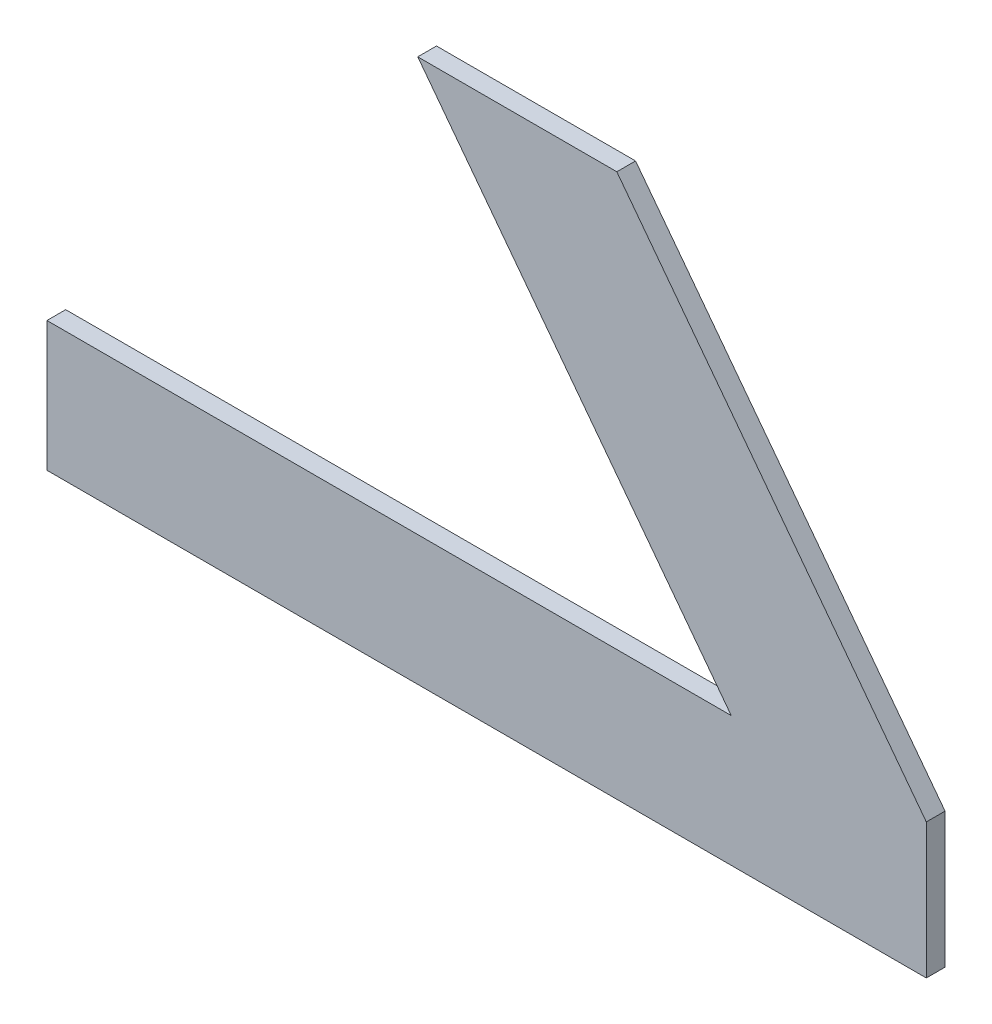
ISO-10303-21;
HEADER;
FILE_DESCRIPTION(('STEP AP214'),'2;1');
FILE_NAME('part.step','',(''),(''),'','','');
FILE_SCHEMA(('AUTOMOTIVE_DESIGN { 1 0 10303 214 1 1 1 1 }'));
ENDSEC;
DATA;
#1=APPLICATION_CONTEXT('core data for automotive mechanical design processes');
#2=APPLICATION_PROTOCOL_DEFINITION('international standard','automotive_design',2000,#1);
#3=PRODUCT_CONTEXT('',#1,'mechanical');
#4=PRODUCT('Part','Part','',(#3));
#5=PRODUCT_RELATED_PRODUCT_CATEGORY('part','',(#4));
#6=PRODUCT_DEFINITION_FORMATION('','',#4);
#7=PRODUCT_DEFINITION_CONTEXT('part definition',#1,'design');
#8=PRODUCT_DEFINITION('design','',#6,#7);
#9=PRODUCT_DEFINITION_SHAPE('','',#8);
#10=(LENGTH_UNIT() NAMED_UNIT(*) SI_UNIT(.MILLI.,.METRE.));
#11=(NAMED_UNIT(*) PLANE_ANGLE_UNIT() SI_UNIT($,.RADIAN.));
#12=(NAMED_UNIT(*) SI_UNIT($,.STERADIAN.) SOLID_ANGLE_UNIT());
#13=UNCERTAINTY_MEASURE_WITH_UNIT(LENGTH_MEASURE(1.E-05),#10,'distance_accuracy_value','');
#14=(GEOMETRIC_REPRESENTATION_CONTEXT(3) GLOBAL_UNCERTAINTY_ASSIGNED_CONTEXT((#13)) GLOBAL_UNIT_ASSIGNED_CONTEXT((#10,
#11,#12)) REPRESENTATION_CONTEXT('',''));
#15=CARTESIAN_POINT('',(0.,0.,0.));
#16=DIRECTION('',(0.,0.,1.));
#17=DIRECTION('',(1.,0.,0.));
#18=AXIS2_PLACEMENT_3D('',#15,#16,#17);
#19=CARTESIAN_POINT('',(11.9230769230769,-15.,0.5));
#20=DIRECTION('',(-1.,0.,0.));
#21=DIRECTION('',(0.,0.,1.));
#22=AXIS2_PLACEMENT_3D('',#19,#20,#21);
#23=PLANE('',#22);
#24=DIRECTION('',(0.,1.,0.));
#25=VECTOR('',#24,1.);
#26=CARTESIAN_POINT('',(11.9230769230769,-15.,0.));
#27=LINE('',#26,#25);
#28=CARTESIAN_POINT('',(11.9230769230769,-15.,0.));
#29=VERTEX_POINT('',#28);
#30=CARTESIAN_POINT('',(11.9230769230769,-11.3942307692308,0.));
#31=VERTEX_POINT('',#30);
#32=EDGE_CURVE('E129',#29,#31,#27,.T.);
#33=ORIENTED_EDGE('',*,*,#32,.T.);
#34=DIRECTION('',(0.,0.,-1.));
#35=VECTOR('',#34,1.);
#36=CARTESIAN_POINT('',(11.9230769230769,-11.3942307692308,0.5));
#37=LINE('',#36,#35);
#38=CARTESIAN_POINT('',(11.9230769230769,-11.3942307692308,0.5));
#39=VERTEX_POINT('',#38);
#40=EDGE_CURVE('E152',#39,#31,#37,.T.);
#41=ORIENTED_EDGE('',*,*,#40,.F.);
#42=DIRECTION('',(0.,1.,0.));
#43=VECTOR('',#42,1.);
#44=CARTESIAN_POINT('',(11.9230769230769,-15.,0.5));
#45=LINE('',#44,#43);
#46=CARTESIAN_POINT('',(11.9230769230769,-15.,0.5));
#47=VERTEX_POINT('',#46);
#48=EDGE_CURVE('E153',#47,#39,#45,.T.);
#49=ORIENTED_EDGE('',*,*,#48,.F.);
#50=DIRECTION('',(0.,0.,-1.));
#51=VECTOR('',#50,1.);
#52=CARTESIAN_POINT('',(11.9230769230769,-15.,0.5));
#53=LINE('',#52,#51);
#54=EDGE_CURVE('E48',#47,#29,#53,.T.);
#55=ORIENTED_EDGE('',*,*,#54,.T.);
#56=EDGE_LOOP('',(#33,#41,#49,#55));
#57=FACE_BOUND('',#56,.T.);
#58=ADVANCED_FACE('F39',(#57),#23,.F.);
#59=CARTESIAN_POINT('',(-11.5384615384615,-15.,0.5));
#60=DIRECTION('',(0.,1.,0.));
#61=DIRECTION('',(0.,0.,1.));
#62=AXIS2_PLACEMENT_3D('',#59,#60,#61);
#63=PLANE('',#62);
#64=DIRECTION('',(1.,0.,0.));
#65=VECTOR('',#64,1.);
#66=CARTESIAN_POINT('',(-11.5384615384615,-15.,0.));
#67=LINE('',#66,#65);
#68=CARTESIAN_POINT('',(-11.5384615384615,-15.,0.));
#69=VERTEX_POINT('',#68);
#70=EDGE_CURVE('E121',#69,#29,#67,.T.);
#71=ORIENTED_EDGE('',*,*,#70,.T.);
#72=ORIENTED_EDGE('',*,*,#54,.F.);
#73=DIRECTION('',(1.,0.,0.));
#74=VECTOR('',#73,1.);
#75=CARTESIAN_POINT('',(-11.5384615384615,-15.,0.5));
#76=LINE('',#75,#74);
#77=CARTESIAN_POINT('',(-11.5384615384615,-15.,0.5));
#78=VERTEX_POINT('',#77);
#79=EDGE_CURVE('E120',#78,#47,#76,.T.);
#80=ORIENTED_EDGE('',*,*,#79,.F.);
#81=DIRECTION('',(0.,0.,-1.));
#82=VECTOR('',#81,1.);
#83=CARTESIAN_POINT('',(-11.5384615384615,-15.,0.5));
#84=LINE('',#83,#82);
#85=EDGE_CURVE('E111',#78,#69,#84,.T.);
#86=ORIENTED_EDGE('',*,*,#85,.T.);
#87=EDGE_LOOP('',(#71,#72,#80,#86));
#88=FACE_BOUND('',#87,.T.);
#89=ADVANCED_FACE('F41',(#88),#63,.F.);
#90=CARTESIAN_POINT('',(-11.5384615384615,-11.5384615384615,0.5));
#91=DIRECTION('',(1.,0.,0.));
#92=DIRECTION('',(0.,0.,-1.));
#93=AXIS2_PLACEMENT_3D('',#90,#91,#92);
#94=PLANE('',#93);
#95=DIRECTION('',(0.,-1.,0.));
#96=VECTOR('',#95,1.);
#97=CARTESIAN_POINT('',(-11.5384615384615,-11.5384615384615,0.));
#98=LINE('',#97,#96);
#99=CARTESIAN_POINT('',(-11.5384615384615,-11.5384615384615,0.));
#100=VERTEX_POINT('',#99);
#101=EDGE_CURVE('E106',#100,#69,#98,.T.);
#102=ORIENTED_EDGE('',*,*,#101,.T.);
#103=ORIENTED_EDGE('',*,*,#85,.F.);
#104=DIRECTION('',(0.,-1.,0.));
#105=VECTOR('',#104,1.);
#106=CARTESIAN_POINT('',(-11.5384615384615,-11.5384615384615,0.5));
#107=LINE('',#106,#105);
#108=CARTESIAN_POINT('',(-11.5384615384615,-11.5384615384615,0.5));
#109=VERTEX_POINT('',#108);
#110=EDGE_CURVE('E124',#109,#78,#107,.T.);
#111=ORIENTED_EDGE('',*,*,#110,.F.);
#112=DIRECTION('',(0.,0.,-1.));
#113=VECTOR('',#112,1.);
#114=CARTESIAN_POINT('',(-11.5384615384615,-11.5384615384615,0.5));
#115=LINE('',#114,#113);
#116=EDGE_CURVE('E113',#109,#100,#115,.T.);
#117=ORIENTED_EDGE('',*,*,#116,.T.);
#118=EDGE_LOOP('',(#102,#103,#111,#117));
#119=FACE_BOUND('',#118,.T.);
#120=ADVANCED_FACE('F112',(#119),#94,.F.);
#121=CARTESIAN_POINT('',(6.71875000000001,-11.5384615384615,0.5));
#122=DIRECTION('',(0.,-1.,0.));
#123=DIRECTION('',(0.,0.,-1.));
#124=AXIS2_PLACEMENT_3D('',#121,#122,#123);
#125=PLANE('',#124);
#126=DIRECTION('',(-1.,0.,0.));
#127=VECTOR('',#126,1.);
#128=CARTESIAN_POINT('',(6.71875000000001,-11.5384615384615,0.));
#129=LINE('',#128,#127);
#130=CARTESIAN_POINT('',(6.71875000000001,-11.5384615384615,0.));
#131=VERTEX_POINT('',#130);
#132=EDGE_CURVE('E104',#131,#100,#129,.T.);
#133=ORIENTED_EDGE('',*,*,#132,.T.);
#134=ORIENTED_EDGE('',*,*,#116,.F.);
#135=DIRECTION('',(-1.,0.,0.));
#136=VECTOR('',#135,1.);
#137=CARTESIAN_POINT('',(6.71875000000001,-11.5384615384615,0.5));
#138=LINE('',#137,#136);
#139=CARTESIAN_POINT('',(6.71875000000001,-11.5384615384615,0.5));
#140=VERTEX_POINT('',#139);
#141=EDGE_CURVE('E170',#140,#109,#138,.T.);
#142=ORIENTED_EDGE('',*,*,#141,.F.);
#143=DIRECTION('',(0.,0.,-1.));
#144=VECTOR('',#143,1.);
#145=CARTESIAN_POINT('',(6.71875000000001,-11.5384615384615,0.5));
#146=LINE('',#145,#144);
#147=EDGE_CURVE('E147',#140,#131,#146,.T.);
#148=ORIENTED_EDGE('',*,*,#147,.T.);
#149=EDGE_LOOP('',(#133,#134,#142,#148));
#150=FACE_BOUND('',#149,.T.);
#151=ADVANCED_FACE('F171',(#150),#125,.F.);
#152=CARTESIAN_POINT('',(5.25841346153847,-9.609375,0.5));
#153=DIRECTION('',(0.797309467874592,0.603570718671421,0.));
#154=DIRECTION('',(-0.603570718671421,0.797309467874592,0.));
#155=AXIS2_PLACEMENT_3D('',#152,#153,#154);
#156=PLANE('',#155);
#157=DIRECTION('',(0.603570718671421,-0.797309467874592,0.));
#158=VECTOR('',#157,1.);
#159=CARTESIAN_POINT('',(5.25841346153847,-9.609375,0.));
#160=LINE('',#159,#158);
#161=CARTESIAN_POINT('',(5.25841346153847,-9.609375,0.));
#162=VERTEX_POINT('',#161);
#163=EDGE_CURVE('E145',#162,#131,#160,.T.);
#164=ORIENTED_EDGE('',*,*,#163,.T.);
#165=ORIENTED_EDGE('',*,*,#147,.F.);
#166=DIRECTION('',(0.603570718671421,-0.797309467874592,0.));
#167=VECTOR('',#166,1.);
#168=CARTESIAN_POINT('',(5.25841346153847,-9.609375,0.5));
#169=LINE('',#168,#167);
#170=CARTESIAN_POINT('',(5.25841346153847,-9.609375,0.5));
#171=VERTEX_POINT('',#170);
#172=EDGE_CURVE('E166',#171,#140,#169,.T.);
#173=ORIENTED_EDGE('',*,*,#172,.F.);
#174=DIRECTION('',(0.,0.,-1.));
#175=VECTOR('',#174,1.);
#176=CARTESIAN_POINT('',(5.25841346153847,-9.609375,0.5));
#177=LINE('',#176,#175);
#178=EDGE_CURVE('E149',#171,#162,#177,.T.);
#179=ORIENTED_EDGE('',*,*,#178,.T.);
#180=EDGE_LOOP('',(#164,#165,#173,#179));
#181=FACE_BOUND('',#180,.T.);
#182=ADVANCED_FACE('F172',(#181),#156,.F.);
#183=CARTESIAN_POINT('',(-4.15519373240783,9.81705667858863,0.5));
#184=DIRECTION('',(0.,0.,1.));
#185=DIRECTION('',(1.,0.,0.));
#186=AXIS2_PLACEMENT_3D('',#183,#184,#185);
#187=PLANE('',#186);
#188=DIRECTION('',(1.,0.,0.));
#189=VECTOR('',#188,1.);
#190=CARTESIAN_POINT('',(-4.15519373240783,-0.5,0.5));
#191=LINE('',#190,#189);
#192=CARTESIAN_POINT('',(-1.64545216079742,-0.5,0.5));
#193=VERTEX_POINT('',#192);
#194=CARTESIAN_POINT('',(3.66590170544844,-0.500000000000001,0.5));
#195=VERTEX_POINT('',#194);
#196=EDGE_CURVE('E72',#193,#195,#191,.T.);
#197=ORIENTED_EDGE('',*,*,#196,.F.);
#198=DIRECTION('',(0.604014651137064,-0.796973212355203,0.));
#199=VECTOR('',#198,1.);
#200=CARTESIAN_POINT('',(-10.7692307692308,11.5384615384615,0.5));
#201=LINE('',#200,#199);
#202=EDGE_CURVE('E168',#193,#171,#201,.T.);
#203=ORIENTED_EDGE('',*,*,#202,.T.);
#204=ORIENTED_EDGE('',*,*,#172,.T.);
#205=ORIENTED_EDGE('',*,*,#141,.T.);
#206=ORIENTED_EDGE('',*,*,#110,.T.);
#207=ORIENTED_EDGE('',*,*,#79,.T.);
#208=ORIENTED_EDGE('',*,*,#48,.T.);
#209=DIRECTION('',(-0.604042195928795,0.796952335800278,0.));
#210=VECTOR('',#209,1.);
#211=CARTESIAN_POINT('',(11.9230769230769,-11.3942307692308,0.5));
#212=LINE('',#211,#210);
#213=EDGE_CURVE('E159',#39,#195,#212,.T.);
#214=ORIENTED_EDGE('',*,*,#213,.T.);
#215=EDGE_LOOP('',(#197,#203,#204,#205,#206,#207,#208,#214));
#216=FACE_BOUND('',#215,.T.);
#217=ADVANCED_FACE('F162',(#216),#187,.T.);
#218=CARTESIAN_POINT('',(-10.7692307692308,11.5384615384615,0.5));
#219=DIRECTION('',(0.796973212355203,0.604014651137063,0.));
#220=DIRECTION('',(-0.604014651137063,0.796973212355203,0.));
#221=AXIS2_PLACEMENT_3D('',#218,#219,#220);
#222=PLANE('',#221);
#223=ORIENTED_EDGE('',*,*,#202,.F.);
#224=DIRECTION('',(0.,0.,-1.));
#225=VECTOR('',#224,1.);
#226=CARTESIAN_POINT('',(-1.64545216079742,-0.5,0.5));
#227=LINE('',#226,#225);
#228=CARTESIAN_POINT('',(-1.64545216079742,-0.500000000000002,0.));
#229=VERTEX_POINT('',#228);
#230=EDGE_CURVE('E54',#193,#229,#227,.T.);
#231=ORIENTED_EDGE('',*,*,#230,.T.);
#232=DIRECTION('',(0.604014651137064,-0.796973212355203,0.));
#233=VECTOR('',#232,1.);
#234=CARTESIAN_POINT('',(-10.7692307692308,11.5384615384615,0.));
#235=LINE('',#234,#233);
#236=EDGE_CURVE('E139',#229,#162,#235,.T.);
#237=ORIENTED_EDGE('',*,*,#236,.T.);
#238=ORIENTED_EDGE('',*,*,#178,.F.);
#239=EDGE_LOOP('',(#223,#231,#237,#238));
#240=FACE_BOUND('',#239,.T.);
#241=ADVANCED_FACE('F191',(#240),#222,.F.);
#242=CARTESIAN_POINT('',(11.9230769230769,-11.3942307692308,0.5));
#243=DIRECTION('',(-0.796952335800278,-0.604042195928795,0.));
#244=DIRECTION('',(0.604042195928795,-0.796952335800278,0.));
#245=AXIS2_PLACEMENT_3D('',#242,#243,#244);
#246=PLANE('',#245);
#247=DIRECTION('',(-0.604042195928795,0.796952335800278,0.));
#248=VECTOR('',#247,1.);
#249=CARTESIAN_POINT('',(11.9230769230769,-11.3942307692308,0.));
#250=LINE('',#249,#248);
#251=CARTESIAN_POINT('',(3.66590170544844,-0.5,0.));
#252=VERTEX_POINT('',#251);
#253=EDGE_CURVE('E135',#31,#252,#250,.T.);
#254=ORIENTED_EDGE('',*,*,#253,.T.);
#255=DIRECTION('',(0.,0.,1.));
#256=VECTOR('',#255,1.);
#257=CARTESIAN_POINT('',(3.66590170544844,-0.5,0.5));
#258=LINE('',#257,#256);
#259=EDGE_CURVE('E67',#252,#195,#258,.T.);
#260=ORIENTED_EDGE('',*,*,#259,.T.);
#261=ORIENTED_EDGE('',*,*,#213,.F.);
#262=ORIENTED_EDGE('',*,*,#40,.T.);
#263=EDGE_LOOP('',(#254,#260,#261,#262));
#264=FACE_BOUND('',#263,.T.);
#265=ADVANCED_FACE('F192',(#264),#246,.F.);
#266=CARTESIAN_POINT('',(-4.15519373240783,9.81705667858863,0.));
#267=DIRECTION('',(0.,0.,1.));
#268=DIRECTION('',(1.,0.,0.));
#269=AXIS2_PLACEMENT_3D('',#266,#267,#268);
#270=PLANE('',#269);
#271=DIRECTION('',(-1.,0.,0.));
#272=VECTOR('',#271,1.);
#273=CARTESIAN_POINT('',(-17.,-0.5,0.));
#274=LINE('',#273,#272);
#275=EDGE_CURVE('E11',#252,#229,#274,.T.);
#276=ORIENTED_EDGE('',*,*,#275,.F.);
#277=ORIENTED_EDGE('',*,*,#253,.F.);
#278=ORIENTED_EDGE('',*,*,#32,.F.);
#279=ORIENTED_EDGE('',*,*,#70,.F.);
#280=ORIENTED_EDGE('',*,*,#101,.F.);
#281=ORIENTED_EDGE('',*,*,#132,.F.);
#282=ORIENTED_EDGE('',*,*,#163,.F.);
#283=ORIENTED_EDGE('',*,*,#236,.F.);
#284=EDGE_LOOP('',(#276,#277,#278,#279,#280,#281,#282,#283));
#285=FACE_BOUND('',#284,.T.);
#286=ADVANCED_FACE('F130',(#285),#270,.F.);
#287=CARTESIAN_POINT('',(-17.,-0.5,1.));
#288=DIRECTION('',(0.,-1.,0.));
#289=DIRECTION('',(0.,0.,-1.));
#290=AXIS2_PLACEMENT_3D('',#287,#288,#289);
#291=PLANE('',#290);
#292=ORIENTED_EDGE('',*,*,#275,.T.);
#293=ORIENTED_EDGE('',*,*,#230,.F.);
#294=ORIENTED_EDGE('',*,*,#196,.T.);
#295=ORIENTED_EDGE('',*,*,#259,.F.);
#296=EDGE_LOOP('',(#292,#293,#294,#295));
#297=FACE_BOUND('',#296,.T.);
#298=ADVANCED_FACE('F211',(#297),#291,.F.);
#299=CLOSED_SHELL('',(#58,#89,#120,#151,#182,#217,#241,#265,#286,#298));
#300=MANIFOLD_SOLID_BREP('B2',#299);
#301=ADVANCED_BREP_SHAPE_REPRESENTATION('',(#18,#300),#14);
#302=SHAPE_DEFINITION_REPRESENTATION(#9,#301);
ENDSEC;
END-ISO-10303-21;
